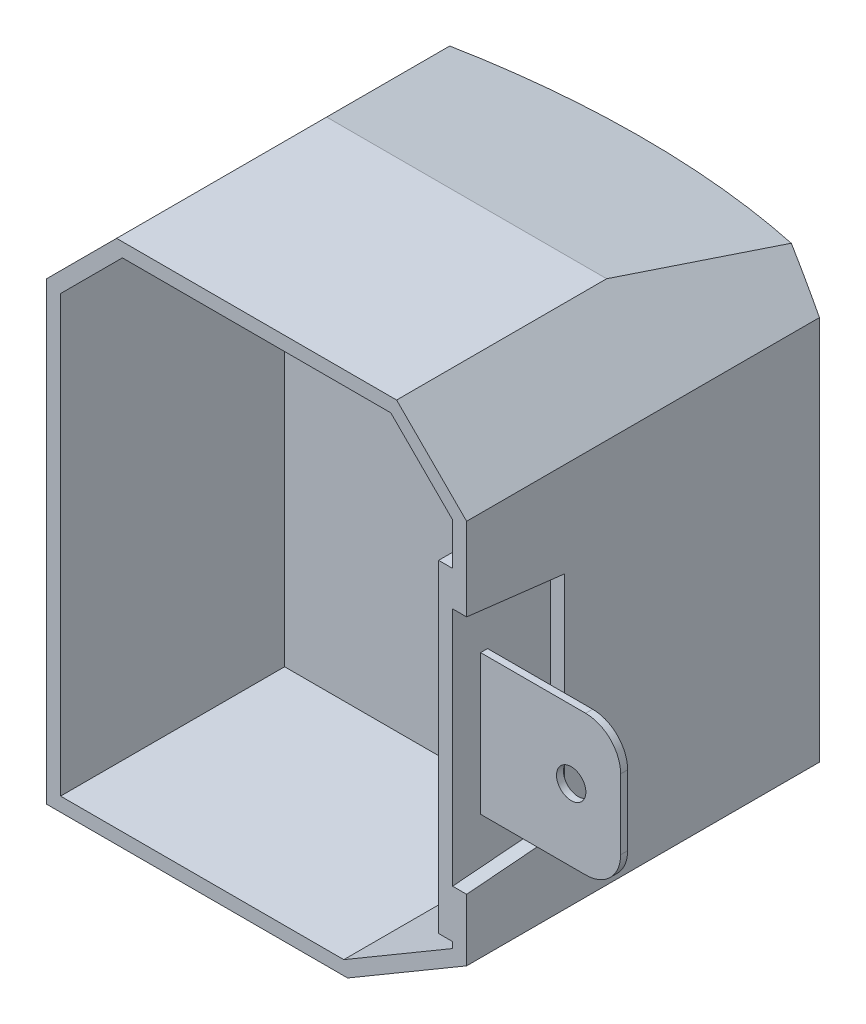
ISO-10303-21;
HEADER;
FILE_DESCRIPTION(('STEP AP214'),'2;1');
FILE_NAME('part.step','',(''),(''),'','','');
FILE_SCHEMA(('AUTOMOTIVE_DESIGN { 1 0 10303 214 1 1 1 1 }'));
ENDSEC;
DATA;
#1=APPLICATION_CONTEXT('core data for automotive mechanical design processes');
#2=APPLICATION_PROTOCOL_DEFINITION('international standard','automotive_design',2000,#1);
#3=PRODUCT_CONTEXT('',#1,'mechanical');
#4=PRODUCT('Part','Part','',(#3));
#5=PRODUCT_RELATED_PRODUCT_CATEGORY('part','',(#4));
#6=PRODUCT_DEFINITION_FORMATION('','',#4);
#7=PRODUCT_DEFINITION_CONTEXT('part definition',#1,'design');
#8=PRODUCT_DEFINITION('design','',#6,#7);
#9=PRODUCT_DEFINITION_SHAPE('','',#8);
#10=(LENGTH_UNIT() NAMED_UNIT(*) SI_UNIT(.MILLI.,.METRE.));
#11=(NAMED_UNIT(*) PLANE_ANGLE_UNIT() SI_UNIT($,.RADIAN.));
#12=(NAMED_UNIT(*) SI_UNIT($,.STERADIAN.) SOLID_ANGLE_UNIT());
#13=UNCERTAINTY_MEASURE_WITH_UNIT(LENGTH_MEASURE(1.E-05),#10,'distance_accuracy_value','');
#14=(GEOMETRIC_REPRESENTATION_CONTEXT(3) GLOBAL_UNCERTAINTY_ASSIGNED_CONTEXT((#13)) GLOBAL_UNIT_ASSIGNED_CONTEXT((#10,
#11,#12)) REPRESENTATION_CONTEXT('',''));
#15=CARTESIAN_POINT('',(0.,0.,0.));
#16=DIRECTION('',(0.,0.,1.));
#17=DIRECTION('',(1.,0.,0.));
#18=AXIS2_PLACEMENT_3D('',#15,#16,#17);
#19=CARTESIAN_POINT('',(58.,0.,0.));
#20=DIRECTION('',(-1.,0.,0.));
#21=DIRECTION('',(0.,0.,1.));
#22=AXIS2_PLACEMENT_3D('',#19,#20,#21);
#23=PLANE('',#22);
#24=DIRECTION('',(0.,1.,0.));
#25=VECTOR('',#24,1.);
#26=CARTESIAN_POINT('',(58.,11.1438921086254,41.));
#27=LINE('',#26,#25);
#28=CARTESIAN_POINT('',(58.,20.,41.));
#29=VERTEX_POINT('',#28);
#30=CARTESIAN_POINT('',(58.,51.5,41.));
#31=VERTEX_POINT('',#30);
#32=EDGE_CURVE('E470',#29,#31,#27,.T.);
#33=ORIENTED_EDGE('',*,*,#32,.T.);
#34=DIRECTION('',(0.,0.118173158234436,0.99299300333532));
#35=VECTOR('',#34,1.);
#36=CARTESIAN_POINT('',(58.,48.8242190299288,18.5157758205343));
#37=LINE('',#36,#35);
#38=CARTESIAN_POINT('',(58.,53.1660985623515,55.));
#39=VERTEX_POINT('',#38);
#40=EDGE_CURVE('E473',#31,#39,#37,.T.);
#41=ORIENTED_EDGE('',*,*,#40,.T.);
#42=DIRECTION('',(0.,1.,0.));
#43=VECTOR('',#42,1.);
#44=CARTESIAN_POINT('',(58.,53.1660985623515,55.));
#45=LINE('',#44,#43);
#46=CARTESIAN_POINT('',(58.,18.85481044112,55.));
#47=VERTEX_POINT('',#46);
#48=EDGE_CURVE('E306',#47,#39,#45,.T.);
#49=ORIENTED_EDGE('',*,*,#48,.F.);
#50=DIRECTION('',(0.,0.0815269557017353,-0.996671137082843));
#51=VECTOR('',#50,1.);
#52=CARTESIAN_POINT('',(58.,21.403736744698,23.8392476394972));
#53=LINE('',#52,#51);
#54=EDGE_CURVE('E467',#47,#29,#53,.T.);
#55=ORIENTED_EDGE('',*,*,#54,.T.);
#56=EDGE_LOOP('',(#33,#41,#49,#55));
#57=FACE_BOUND('',#56,.T.);
#58=DIRECTION('',(0.,0.,1.));
#59=VECTOR('',#58,1.);
#60=CARTESIAN_POINT('',(58.,45.75,50.));
#61=LINE('',#60,#59);
#62=CARTESIAN_POINT('',(58.,45.75,50.));
#63=VERTEX_POINT('',#62);
#64=CARTESIAN_POINT('',(58.,45.75,51.));
#65=VERTEX_POINT('',#64);
#66=EDGE_CURVE('E256',#63,#65,#61,.T.);
#67=ORIENTED_EDGE('',*,*,#66,.F.);
#68=DIRECTION('',(0.,1.,0.));
#69=VECTOR('',#68,1.);
#70=CARTESIAN_POINT('',(58.,25.75,50.));
#71=LINE('',#70,#69);
#72=CARTESIAN_POINT('',(58.,25.75,50.));
#73=VERTEX_POINT('',#72);
#74=EDGE_CURVE('E268',#73,#63,#71,.T.);
#75=ORIENTED_EDGE('',*,*,#74,.F.);
#76=DIRECTION('',(0.,0.,-1.));
#77=VECTOR('',#76,1.);
#78=CARTESIAN_POINT('',(58.,25.75,51.));
#79=LINE('',#78,#77);
#80=CARTESIAN_POINT('',(58.,25.75,51.));
#81=VERTEX_POINT('',#80);
#82=EDGE_CURVE('E277',#81,#73,#79,.T.);
#83=ORIENTED_EDGE('',*,*,#82,.F.);
#84=DIRECTION('',(0.,-1.,0.));
#85=VECTOR('',#84,1.);
#86=CARTESIAN_POINT('',(58.,45.75,51.));
#87=LINE('',#86,#85);
#88=EDGE_CURVE('E271',#65,#81,#87,.T.);
#89=ORIENTED_EDGE('',*,*,#88,.F.);
#90=EDGE_LOOP('',(#67,#75,#83,#89));
#91=FACE_BOUND('',#90,.T.);
#92=ADVANCED_FACE('F56',(#57,#91),#23,.F.);
#93=CARTESIAN_POINT('',(58.,11.1438921086254,23.));
#94=DIRECTION('',(1.,0.,0.));
#95=DIRECTION('',(0.,0.,-1.));
#96=AXIS2_PLACEMENT_3D('',#93,#94,#95);
#97=PLANE('',#96);
#98=DIRECTION('',(0.,0.,1.));
#99=VECTOR('',#98,1.);
#100=CARTESIAN_POINT('',(58.,12.004066058032,30.));
#101=LINE('',#100,#99);
#102=CARTESIAN_POINT('',(58.,12.004066058032,30.));
#103=VERTEX_POINT('',#102);
#104=CARTESIAN_POINT('',(58.,12.004066058032,55.));
#105=VERTEX_POINT('',#104);
#106=EDGE_CURVE('E303',#103,#105,#101,.T.);
#107=ORIENTED_EDGE('',*,*,#106,.F.);
#108=DIRECTION('',(0.,-1.,0.));
#109=VECTOR('',#108,1.);
#110=CARTESIAN_POINT('',(58.,58.1660985623515,30.));
#111=LINE('',#110,#109);
#112=CARTESIAN_POINT('',(58.,58.1660985623515,30.));
#113=VERTEX_POINT('',#112);
#114=EDGE_CURVE('E289',#113,#103,#111,.T.);
#115=ORIENTED_EDGE('',*,*,#114,.F.);
#116=DIRECTION('',(0.,0.,-1.));
#117=VECTOR('',#116,1.);
#118=CARTESIAN_POINT('',(58.,58.1660985623515,55.));
#119=LINE('',#118,#117);
#120=CARTESIAN_POINT('',(58.,58.1660985623515,55.));
#121=VERTEX_POINT('',#120);
#122=EDGE_CURVE('E294',#121,#113,#119,.T.);
#123=ORIENTED_EDGE('',*,*,#122,.F.);
#124=DIRECTION('',(0.,1.,0.));
#125=VECTOR('',#124,1.);
#126=CARTESIAN_POINT('',(58.,11.1438921086254,55.));
#127=LINE('',#126,#125);
#128=CARTESIAN_POINT('',(58.,64.1715728752538,55.));
#129=VERTEX_POINT('',#128);
#130=EDGE_CURVE('E333',#121,#129,#127,.T.);
#131=ORIENTED_EDGE('',*,*,#130,.T.);
#132=DIRECTION('',(0.,0.,1.));
#133=VECTOR('',#132,1.);
#134=CARTESIAN_POINT('',(58.,64.1715728752538,23.));
#135=LINE('',#134,#133);
#136=CARTESIAN_POINT('',(58.,64.1715728752538,23.));
#137=VERTEX_POINT('',#136);
#138=EDGE_CURVE('E362',#137,#129,#135,.T.);
#139=ORIENTED_EDGE('',*,*,#138,.F.);
#140=DIRECTION('',(0.,1.,0.));
#141=VECTOR('',#140,1.);
#142=CARTESIAN_POINT('',(58.,11.1438921086254,23.));
#143=LINE('',#142,#141);
#144=CARTESIAN_POINT('',(58.,11.1438921086254,23.));
#145=VERTEX_POINT('',#144);
#146=EDGE_CURVE('E340',#145,#137,#143,.T.);
#147=ORIENTED_EDGE('',*,*,#146,.F.);
#148=DIRECTION('',(0.,0.,1.));
#149=VECTOR('',#148,1.);
#150=CARTESIAN_POINT('',(58.,11.1438921086254,23.));
#151=LINE('',#150,#149);
#152=CARTESIAN_POINT('',(58.,11.1438921086254,55.));
#153=VERTEX_POINT('',#152);
#154=EDGE_CURVE('E382',#145,#153,#151,.T.);
#155=ORIENTED_EDGE('',*,*,#154,.T.);
#156=EDGE_CURVE('E363',#153,#105,#127,.T.);
#157=ORIENTED_EDGE('',*,*,#156,.T.);
#158=EDGE_LOOP('',(#107,#115,#123,#131,#139,#147,#155,#157));
#159=FACE_BOUND('',#158,.T.);
#160=ADVANCED_FACE('F517',(#159),#97,.F.);
#161=CARTESIAN_POINT('',(-3.,75.,25.));
#162=DIRECTION('',(0.,-0.98058067569092,0.196116135138184));
#163=DIRECTION('',(0.,-0.196116135138184,-0.98058067569092));
#164=AXIS2_PLACEMENT_3D('',#161,#162,#163);
#165=PLANE('',#164);
#166=DIRECTION('',(0.192450089729876,-0.192450089729875,-0.962250448649376));
#167=VECTOR('',#166,1.);
#168=CARTESIAN_POINT('',(48.037037037037,76.962962962963,34.8148148148148));
#169=LINE('',#168,#167);
#170=CARTESIAN_POINT('',(50.,75.,25.));
#171=VERTEX_POINT('',#170);
#172=CARTESIAN_POINT('',(54.3957199879455,70.6042800120545,3.0214000602723));
#173=VERTEX_POINT('',#172);
#174=EDGE_CURVE('E460',#171,#173,#169,.T.);
#175=ORIENTED_EDGE('',*,*,#174,.T.);
#176=CARTESIAN_POINT('',(30.,90.,100.));
#177=DIRECTION('',(0.,-0.98058067569092,0.196116135138184));
#178=DIRECTION('',(0.,0.196116135138184,0.98058067569092));
#179=AXIS2_PLACEMENT_3D('',#176,#177,#178);
#180=ELLIPSE('',#179,101.980390271856,100.);
#181=CARTESIAN_POINT('',(5.60428001205445,70.6042800120544,3.02140006027228));
#182=VERTEX_POINT('',#181);
#183=EDGE_CURVE('E404',#182,#173,#180,.T.);
#184=ORIENTED_EDGE('',*,*,#183,.F.);
#185=DIRECTION('',(0.192450089729876,0.192450089729875,0.962250448649376));
#186=VECTOR('',#185,1.);
#187=CARTESIAN_POINT('',(9.51851851851852,74.5185185185185,22.5925925925926));
#188=LINE('',#187,#186);
#189=CARTESIAN_POINT('',(10.,75.,25.));
#190=VERTEX_POINT('',#189);
#191=EDGE_CURVE('E458',#182,#190,#188,.T.);
#192=ORIENTED_EDGE('',*,*,#191,.T.);
#193=DIRECTION('',(1.,0.,0.));
#194=VECTOR('',#193,1.);
#195=CARTESIAN_POINT('',(-3.,75.,25.));
#196=LINE('',#195,#194);
#197=EDGE_CURVE('E433',#190,#171,#196,.T.);
#198=ORIENTED_EDGE('',*,*,#197,.T.);
#199=EDGE_LOOP('',(#175,#184,#192,#198));
#200=FACE_BOUND('',#199,.T.);
#201=ADVANCED_FACE('F523',(#200),#165,.F.);
#202=CARTESIAN_POINT('',(-3.,0.,20.));
#203=DIRECTION('',(0.,0.894427190999916,0.447213595499958));
#204=DIRECTION('',(0.,-0.447213595499958,0.894427190999916));
#205=AXIS2_PLACEMENT_3D('',#202,#203,#204);
#206=PLANE('',#205);
#207=CARTESIAN_POINT('',(30.,-40.,100.));
#208=DIRECTION('',(0.,0.894427190999916,0.447213595499958));
#209=DIRECTION('',(0.,0.447213595499958,-0.894427190999916));
#210=AXIS2_PLACEMENT_3D('',#207,#208,#209);
#211=ELLIPSE('',#210,111.803398874989,100.);
#212=CARTESIAN_POINT('',(56.8732597656954,8.16074103864437,3.67851792271126));
#213=VERTEX_POINT('',#212);
#214=CARTESIAN_POINT('',(0.,7.69696007084729,4.60607985830543));
#215=VERTEX_POINT('',#214);
#216=EDGE_CURVE('E406',#213,#215,#211,.T.);
#217=ORIENTED_EDGE('',*,*,#216,.F.);
#218=DIRECTION('',(-0.605216026332569,-0.356009427254452,0.712018854508904));
#219=VECTOR('',#218,1.);
#220=CARTESIAN_POINT('',(26.1508238276299,-9.91128010139417,39.8225602027883));
#221=LINE('',#220,#219);
#222=CARTESIAN_POINT('',(43.,0.,20.));
#223=VERTEX_POINT('',#222);
#224=EDGE_CURVE('E456',#213,#223,#221,.T.);
#225=ORIENTED_EDGE('',*,*,#224,.T.);
#226=DIRECTION('',(1.,0.,0.));
#227=VECTOR('',#226,1.);
#228=CARTESIAN_POINT('',(-3.,0.,20.));
#229=LINE('',#228,#227);
#230=CARTESIAN_POINT('',(0.,0.,20.));
#231=VERTEX_POINT('',#230);
#232=EDGE_CURVE('E434',#231,#223,#229,.T.);
#233=ORIENTED_EDGE('',*,*,#232,.F.);
#234=DIRECTION('',(0.,-0.447213595499958,0.894427190999916));
#235=VECTOR('',#234,1.);
#236=CARTESIAN_POINT('',(0.,1.,18.));
#237=LINE('',#236,#235);
#238=EDGE_CURVE('E437',#215,#231,#237,.T.);
#239=ORIENTED_EDGE('',*,*,#238,.F.);
#240=EDGE_LOOP('',(#217,#225,#233,#239));
#241=FACE_BOUND('',#240,.T.);
#242=ADVANCED_FACE('F602',(#241),#206,.F.);
#243=CARTESIAN_POINT('',(60.,0.,55.));
#244=DIRECTION('',(-1.,0.,0.));
#245=DIRECTION('',(0.,0.,1.));
#246=AXIS2_PLACEMENT_3D('',#243,#244,#245);
#247=PLANE('',#246);
#248=DIRECTION('',(0.,1.,0.));
#249=VECTOR('',#248,1.);
#250=CARTESIAN_POINT('',(60.,0.,55.));
#251=LINE('',#250,#249);
#252=CARTESIAN_POINT('',(60.,53.1660985623515,55.));
#253=VERTEX_POINT('',#252);
#254=CARTESIAN_POINT('',(60.,65.,55.));
#255=VERTEX_POINT('',#254);
#256=EDGE_CURVE('E446',#253,#255,#251,.T.);
#257=ORIENTED_EDGE('',*,*,#256,.F.);
#258=DIRECTION('',(0.,0.118173158234436,0.99299300333532));
#259=VECTOR('',#258,1.);
#260=CARTESIAN_POINT('',(60.,51.5,41.));
#261=LINE('',#260,#259);
#262=CARTESIAN_POINT('',(60.,51.5,41.));
#263=VERTEX_POINT('',#262);
#264=EDGE_CURVE('E322',#263,#253,#261,.T.);
#265=ORIENTED_EDGE('',*,*,#264,.F.);
#266=DIRECTION('',(0.,1.,0.));
#267=VECTOR('',#266,1.);
#268=CARTESIAN_POINT('',(60.,51.5,41.));
#269=LINE('',#268,#267);
#270=CARTESIAN_POINT('',(60.,20.,41.));
#271=VERTEX_POINT('',#270);
#272=EDGE_CURVE('E327',#271,#263,#269,.T.);
#273=ORIENTED_EDGE('',*,*,#272,.F.);
#274=DIRECTION('',(0.,0.0815269557017353,-0.996671137082843));
#275=VECTOR('',#274,1.);
#276=CARTESIAN_POINT('',(60.,20.,41.));
#277=LINE('',#276,#275);
#278=CARTESIAN_POINT('',(60.,18.85481044112,55.));
#279=VERTEX_POINT('',#278);
#280=EDGE_CURVE('E324',#279,#271,#277,.T.);
#281=ORIENTED_EDGE('',*,*,#280,.F.);
#282=CARTESIAN_POINT('',(60.,10.,55.));
#283=VERTEX_POINT('',#282);
#284=EDGE_CURVE('E447',#283,#279,#251,.T.);
#285=ORIENTED_EDGE('',*,*,#284,.F.);
#286=DIRECTION('',(0.,0.,-1.));
#287=VECTOR('',#286,1.);
#288=CARTESIAN_POINT('',(60.,10.,63.));
#289=LINE('',#288,#287);
#290=CARTESIAN_POINT('',(60.,10.,4.60607985830543));
#291=VERTEX_POINT('',#290);
#292=EDGE_CURVE('E426',#283,#291,#289,.T.);
#293=ORIENTED_EDGE('',*,*,#292,.T.);
#294=DIRECTION('',(0.,1.,0.));
#295=VECTOR('',#294,1.);
#296=CARTESIAN_POINT('',(60.,2.,4.60607985830543));
#297=LINE('',#296,#295);
#298=CARTESIAN_POINT('',(60.,65.,4.60607985830543));
#299=VERTEX_POINT('',#298);
#300=EDGE_CURVE('E384',#291,#299,#297,.T.);
#301=ORIENTED_EDGE('',*,*,#300,.T.);
#302=DIRECTION('',(0.,0.,-1.));
#303=VECTOR('',#302,1.);
#304=CARTESIAN_POINT('',(60.,65.,63.));
#305=LINE('',#304,#303);
#306=EDGE_CURVE('E409',#255,#299,#305,.T.);
#307=ORIENTED_EDGE('',*,*,#306,.F.);
#308=EDGE_LOOP('',(#257,#265,#273,#281,#285,#293,#301,#307));
#309=FACE_BOUND('',#308,.T.);
#310=ADVANCED_FACE('F600',(#309),#247,.F.);
#311=CARTESIAN_POINT('',(43.,0.,63.));
#312=DIRECTION('',(-0.507020126563394,0.86193421515777,0.));
#313=DIRECTION('',(-0.861934215157769,-0.507020126563394,0.));
#314=AXIS2_PLACEMENT_3D('',#311,#312,#313);
#315=PLANE('',#314);
#316=CARTESIAN_POINT('',(30.,-7.6470588235294,100.));
#317=DIRECTION('',(-0.507020126563394,0.86193421515777,0.));
#318=DIRECTION('',(0.861934215157769,0.507020126563394,0.));
#319=AXIS2_PLACEMENT_3D('',#316,#317,#318);
#320=ELLIPSE('',#319,116.018134843035,100.);
#321=EDGE_CURVE('E399',#291,#213,#320,.T.);
#322=ORIENTED_EDGE('',*,*,#321,.F.);
#323=ORIENTED_EDGE('',*,*,#292,.F.);
#324=DIRECTION('',(-0.861934215157769,-0.507020126563394,0.));
#325=VECTOR('',#324,1.);
#326=CARTESIAN_POINT('',(11.0539845758355,-18.7917737789203,55.));
#327=LINE('',#326,#325);
#328=CARTESIAN_POINT('',(43.,0.,55.));
#329=VERTEX_POINT('',#328);
#330=EDGE_CURVE('E429',#283,#329,#327,.T.);
#331=ORIENTED_EDGE('',*,*,#330,.T.);
#332=DIRECTION('',(0.,0.,-1.));
#333=VECTOR('',#332,1.);
#334=CARTESIAN_POINT('',(43.,0.,63.));
#335=LINE('',#334,#333);
#336=EDGE_CURVE('E425',#329,#223,#335,.T.);
#337=ORIENTED_EDGE('',*,*,#336,.T.);
#338=ORIENTED_EDGE('',*,*,#224,.F.);
#339=EDGE_LOOP('',(#322,#323,#331,#337,#338));
#340=FACE_BOUND('',#339,.T.);
#341=ADVANCED_FACE('F591',(#340),#315,.F.);
#342=CARTESIAN_POINT('',(50.,75.,63.));
#343=DIRECTION('',(-0.707106781186547,-0.707106781186548,0.));
#344=DIRECTION('',(0.707106781186548,-0.707106781186547,0.));
#345=AXIS2_PLACEMENT_3D('',#342,#343,#344);
#346=PLANE('',#345);
#347=CARTESIAN_POINT('',(30.,95.,100.));
#348=DIRECTION('',(-0.707106781186547,-0.707106781186548,0.));
#349=DIRECTION('',(-0.707106781186548,0.707106781186547,0.));
#350=AXIS2_PLACEMENT_3D('',#347,#348,#349);
#351=ELLIPSE('',#350,141.421356237309,100.);
#352=EDGE_CURVE('E465',#173,#299,#351,.T.);
#353=ORIENTED_EDGE('',*,*,#352,.F.);
#354=ORIENTED_EDGE('',*,*,#174,.F.);
#355=DIRECTION('',(0.,0.,-1.));
#356=VECTOR('',#355,1.);
#357=CARTESIAN_POINT('',(50.,75.,63.));
#358=LINE('',#357,#356);
#359=CARTESIAN_POINT('',(50.,75.,55.));
#360=VERTEX_POINT('',#359);
#361=EDGE_CURVE('E413',#360,#171,#358,.T.);
#362=ORIENTED_EDGE('',*,*,#361,.F.);
#363=DIRECTION('',(0.707106781186548,-0.707106781186547,0.));
#364=VECTOR('',#363,1.);
#365=CARTESIAN_POINT('',(62.5,62.5,55.));
#366=LINE('',#365,#364);
#367=EDGE_CURVE('E422',#360,#255,#366,.T.);
#368=ORIENTED_EDGE('',*,*,#367,.T.);
#369=ORIENTED_EDGE('',*,*,#306,.T.);
#370=EDGE_LOOP('',(#353,#354,#362,#368,#369));
#371=FACE_BOUND('',#370,.T.);
#372=ADVANCED_FACE('F587',(#371),#346,.F.);
#373=CARTESIAN_POINT('',(0.,75.,55.));
#374=DIRECTION('',(1.,0.,0.));
#375=DIRECTION('',(0.,0.,-1.));
#376=AXIS2_PLACEMENT_3D('',#373,#374,#375);
#377=PLANE('',#376);
#378=DIRECTION('',(0.,1.,0.));
#379=VECTOR('',#378,1.);
#380=CARTESIAN_POINT('',(0.,2.,4.60607985830543));
#381=LINE('',#380,#379);
#382=CARTESIAN_POINT('',(0.,65.,4.60607985830543));
#383=VERTEX_POINT('',#382);
#384=EDGE_CURVE('E402',#215,#383,#381,.T.);
#385=ORIENTED_EDGE('',*,*,#384,.F.);
#386=ORIENTED_EDGE('',*,*,#238,.T.);
#387=DIRECTION('',(0.,0.,-1.));
#388=VECTOR('',#387,1.);
#389=CARTESIAN_POINT('',(0.,0.,55.));
#390=LINE('',#389,#388);
#391=CARTESIAN_POINT('',(0.,0.,55.));
#392=VERTEX_POINT('',#391);
#393=EDGE_CURVE('E453',#392,#231,#390,.T.);
#394=ORIENTED_EDGE('',*,*,#393,.F.);
#395=DIRECTION('',(0.,-1.,0.));
#396=VECTOR('',#395,1.);
#397=CARTESIAN_POINT('',(0.,75.,55.));
#398=LINE('',#397,#396);
#399=CARTESIAN_POINT('',(0.,65.,55.));
#400=VERTEX_POINT('',#399);
#401=EDGE_CURVE('E441',#400,#392,#398,.T.);
#402=ORIENTED_EDGE('',*,*,#401,.F.);
#403=DIRECTION('',(0.,0.,-1.));
#404=VECTOR('',#403,1.);
#405=CARTESIAN_POINT('',(0.,65.,63.));
#406=LINE('',#405,#404);
#407=EDGE_CURVE('E416',#400,#383,#406,.T.);
#408=ORIENTED_EDGE('',*,*,#407,.T.);
#409=EDGE_LOOP('',(#385,#386,#394,#402,#408));
#410=FACE_BOUND('',#409,.T.);
#411=ADVANCED_FACE('F590',(#410),#377,.F.);
#412=CARTESIAN_POINT('',(10.,75.,63.));
#413=DIRECTION('',(0.707106781186547,-0.707106781186548,0.));
#414=DIRECTION('',(0.707106781186548,0.707106781186547,0.));
#415=AXIS2_PLACEMENT_3D('',#412,#413,#414);
#416=PLANE('',#415);
#417=CARTESIAN_POINT('',(30.,95.,100.));
#418=DIRECTION('',(0.707106781186547,-0.707106781186548,0.));
#419=DIRECTION('',(0.707106781186548,0.707106781186547,0.));
#420=AXIS2_PLACEMENT_3D('',#417,#418,#419);
#421=ELLIPSE('',#420,141.421356237309,100.);
#422=EDGE_CURVE('E463',#383,#182,#421,.T.);
#423=ORIENTED_EDGE('',*,*,#422,.F.);
#424=ORIENTED_EDGE('',*,*,#407,.F.);
#425=DIRECTION('',(0.707106781186548,0.707106781186547,0.));
#426=VECTOR('',#425,1.);
#427=CARTESIAN_POINT('',(-32.5,32.5,55.));
#428=LINE('',#427,#426);
#429=CARTESIAN_POINT('',(10.,75.,55.));
#430=VERTEX_POINT('',#429);
#431=EDGE_CURVE('E412',#400,#430,#428,.T.);
#432=ORIENTED_EDGE('',*,*,#431,.T.);
#433=DIRECTION('',(0.,0.,-1.));
#434=VECTOR('',#433,1.);
#435=CARTESIAN_POINT('',(10.,75.,63.));
#436=LINE('',#435,#434);
#437=EDGE_CURVE('E408',#430,#190,#436,.T.);
#438=ORIENTED_EDGE('',*,*,#437,.T.);
#439=ORIENTED_EDGE('',*,*,#191,.F.);
#440=EDGE_LOOP('',(#423,#424,#432,#438,#439));
#441=FACE_BOUND('',#440,.T.);
#442=ADVANCED_FACE('F593',(#441),#416,.F.);
#443=CARTESIAN_POINT('',(0.,0.,55.));
#444=DIRECTION('',(0.,1.,0.));
#445=DIRECTION('',(0.,0.,1.));
#446=AXIS2_PLACEMENT_3D('',#443,#444,#445);
#447=PLANE('',#446);
#448=ORIENTED_EDGE('',*,*,#232,.T.);
#449=ORIENTED_EDGE('',*,*,#336,.F.);
#450=DIRECTION('',(1.,0.,0.));
#451=VECTOR('',#450,1.);
#452=CARTESIAN_POINT('',(0.,0.,55.));
#453=LINE('',#452,#451);
#454=EDGE_CURVE('E443',#392,#329,#453,.T.);
#455=ORIENTED_EDGE('',*,*,#454,.F.);
#456=ORIENTED_EDGE('',*,*,#393,.T.);
#457=EDGE_LOOP('',(#448,#449,#455,#456));
#458=FACE_BOUND('',#457,.T.);
#459=ADVANCED_FACE('F596',(#458),#447,.F.);
#460=CARTESIAN_POINT('',(60.,75.,55.));
#461=DIRECTION('',(0.,-1.,0.));
#462=DIRECTION('',(0.,0.,-1.));
#463=AXIS2_PLACEMENT_3D('',#460,#461,#462);
#464=PLANE('',#463);
#465=DIRECTION('',(-1.,0.,0.));
#466=VECTOR('',#465,1.);
#467=CARTESIAN_POINT('',(60.,75.,55.));
#468=LINE('',#467,#466);
#469=EDGE_CURVE('E450',#360,#430,#468,.T.);
#470=ORIENTED_EDGE('',*,*,#469,.F.);
#471=ORIENTED_EDGE('',*,*,#361,.T.);
#472=ORIENTED_EDGE('',*,*,#197,.F.);
#473=ORIENTED_EDGE('',*,*,#437,.F.);
#474=EDGE_LOOP('',(#470,#471,#472,#473));
#475=FACE_BOUND('',#474,.T.);
#476=ADVANCED_FACE('F611',(#475),#464,.F.);
#477=CARTESIAN_POINT('',(0.,0.,55.));
#478=DIRECTION('',(0.,0.,1.));
#479=DIRECTION('',(1.,0.,0.));
#480=AXIS2_PLACEMENT_3D('',#477,#478,#479);
#481=PLANE('',#480);
#482=DIRECTION('',(1.,0.,0.));
#483=VECTOR('',#482,1.);
#484=CARTESIAN_POINT('',(28.,18.85481044112,55.));
#485=LINE('',#484,#483);
#486=EDGE_CURVE('E336',#47,#279,#485,.T.);
#487=ORIENTED_EDGE('',*,*,#486,.F.);
#488=ORIENTED_EDGE('',*,*,#48,.T.);
#489=DIRECTION('',(1.,0.,0.));
#490=VECTOR('',#489,1.);
#491=CARTESIAN_POINT('',(28.,53.1660985623515,55.));
#492=LINE('',#491,#490);
#493=EDGE_CURVE('E330',#39,#253,#492,.T.);
#494=ORIENTED_EDGE('',*,*,#493,.T.);
#495=ORIENTED_EDGE('',*,*,#256,.T.);
#496=ORIENTED_EDGE('',*,*,#367,.F.);
#497=ORIENTED_EDGE('',*,*,#469,.T.);
#498=ORIENTED_EDGE('',*,*,#431,.F.);
#499=ORIENTED_EDGE('',*,*,#401,.T.);
#500=ORIENTED_EDGE('',*,*,#454,.T.);
#501=ORIENTED_EDGE('',*,*,#330,.F.);
#502=ORIENTED_EDGE('',*,*,#284,.T.);
#503=EDGE_LOOP('',(#487,#488,#494,#495,#496,#497,#498,#499,#500,#501,#502));
#504=FACE_BOUND('',#503,.T.);
#505=DIRECTION('',(1.,0.,0.));
#506=VECTOR('',#505,1.);
#507=CARTESIAN_POINT('',(56.,12.004066058032,55.));
#508=LINE('',#507,#506);
#509=CARTESIAN_POINT('',(56.,12.004066058032,55.));
#510=VERTEX_POINT('',#509);
#511=EDGE_CURVE('E316',#510,#105,#508,.T.);
#512=ORIENTED_EDGE('',*,*,#511,.T.);
#513=ORIENTED_EDGE('',*,*,#156,.F.);
#514=DIRECTION('',(0.86193421515777,0.507020126563394,0.));
#515=VECTOR('',#514,1.);
#516=CARTESIAN_POINT('',(42.4553834153368,2.,55.));
#517=LINE('',#516,#515);
#518=CARTESIAN_POINT('',(42.4553834153368,2.,55.));
#519=VERTEX_POINT('',#518);
#520=EDGE_CURVE('E344',#519,#153,#517,.T.);
#521=ORIENTED_EDGE('',*,*,#520,.F.);
#522=DIRECTION('',(1.,0.,0.));
#523=VECTOR('',#522,1.);
#524=CARTESIAN_POINT('',(2.,2.,55.));
#525=LINE('',#524,#523);
#526=CARTESIAN_POINT('',(2.,2.,55.));
#527=VERTEX_POINT('',#526);
#528=EDGE_CURVE('E377',#527,#519,#525,.T.);
#529=ORIENTED_EDGE('',*,*,#528,.F.);
#530=DIRECTION('',(0.,-1.,0.));
#531=VECTOR('',#530,1.);
#532=CARTESIAN_POINT('',(2.,64.1715728752538,55.));
#533=LINE('',#532,#531);
#534=CARTESIAN_POINT('',(2.,64.1715728752538,55.));
#535=VERTEX_POINT('',#534);
#536=EDGE_CURVE('E374',#535,#527,#533,.T.);
#537=ORIENTED_EDGE('',*,*,#536,.F.);
#538=DIRECTION('',(-0.707106781186548,-0.707106781186548,0.));
#539=VECTOR('',#538,1.);
#540=CARTESIAN_POINT('',(10.8284271247462,73.,55.));
#541=LINE('',#540,#539);
#542=CARTESIAN_POINT('',(10.8284271247462,73.,55.));
#543=VERTEX_POINT('',#542);
#544=EDGE_CURVE('E371',#543,#535,#541,.T.);
#545=ORIENTED_EDGE('',*,*,#544,.F.);
#546=DIRECTION('',(-1.,0.,0.));
#547=VECTOR('',#546,1.);
#548=CARTESIAN_POINT('',(49.1715728752538,73.,55.));
#549=LINE('',#548,#547);
#550=CARTESIAN_POINT('',(49.1715728752538,73.,55.));
#551=VERTEX_POINT('',#550);
#552=EDGE_CURVE('E368',#551,#543,#549,.T.);
#553=ORIENTED_EDGE('',*,*,#552,.F.);
#554=DIRECTION('',(-0.707106781186548,0.707106781186548,0.));
#555=VECTOR('',#554,1.);
#556=CARTESIAN_POINT('',(58.,64.1715728752538,55.));
#557=LINE('',#556,#555);
#558=EDGE_CURVE('E365',#129,#551,#557,.T.);
#559=ORIENTED_EDGE('',*,*,#558,.F.);
#560=ORIENTED_EDGE('',*,*,#130,.F.);
#561=DIRECTION('',(1.,0.,0.));
#562=VECTOR('',#561,1.);
#563=CARTESIAN_POINT('',(56.,58.1660985623515,55.));
#564=LINE('',#563,#562);
#565=CARTESIAN_POINT('',(56.,58.1660985623515,55.));
#566=VERTEX_POINT('',#565);
#567=EDGE_CURVE('E313',#566,#121,#564,.T.);
#568=ORIENTED_EDGE('',*,*,#567,.F.);
#569=DIRECTION('',(0.,1.,0.));
#570=VECTOR('',#569,1.);
#571=CARTESIAN_POINT('',(56.,12.004066058032,55.));
#572=LINE('',#571,#570);
#573=EDGE_CURVE('E296',#510,#566,#572,.T.);
#574=ORIENTED_EDGE('',*,*,#573,.F.);
#575=EDGE_LOOP('',(#512,#513,#521,#529,#537,#545,#553,#559,#560,#568,#574));
#576=FACE_BOUND('',#575,.T.);
#577=ADVANCED_FACE('F585',(#504,#576),#481,.T.);
#578=CARTESIAN_POINT('',(30.,2.,100.));
#579=DIRECTION('',(0.,1.,0.));
#580=DIRECTION('',(0.,0.,1.));
#581=AXIS2_PLACEMENT_3D('',#578,#579,#580);
#582=CYLINDRICAL_SURFACE('',#581,100.);
#583=ORIENTED_EDGE('',*,*,#216,.T.);
#584=ORIENTED_EDGE('',*,*,#384,.T.);
#585=ORIENTED_EDGE('',*,*,#422,.T.);
#586=ORIENTED_EDGE('',*,*,#183,.T.);
#587=ORIENTED_EDGE('',*,*,#352,.T.);
#588=ORIENTED_EDGE('',*,*,#300,.F.);
#589=ORIENTED_EDGE('',*,*,#321,.T.);
#590=EDGE_LOOP('',(#583,#584,#585,#586,#587,#588,#589));
#591=FACE_BOUND('',#590,.T.);
#592=ADVANCED_FACE('F563',(#591),#582,.T.);
#593=CARTESIAN_POINT('',(42.4553834153368,2.,23.));
#594=DIRECTION('',(0.507020126563394,-0.861934215157769,0.));
#595=DIRECTION('',(0.86193421515777,0.507020126563394,0.));
#596=AXIS2_PLACEMENT_3D('',#593,#594,#595);
#597=PLANE('',#596);
#598=ORIENTED_EDGE('',*,*,#520,.T.);
#599=ORIENTED_EDGE('',*,*,#154,.F.);
#600=DIRECTION('',(0.86193421515777,0.507020126563394,0.));
#601=VECTOR('',#600,1.);
#602=CARTESIAN_POINT('',(42.4553834153368,2.,23.));
#603=LINE('',#602,#601);
#604=CARTESIAN_POINT('',(42.4553834153368,2.,23.));
#605=VERTEX_POINT('',#604);
#606=EDGE_CURVE('E359',#605,#145,#603,.T.);
#607=ORIENTED_EDGE('',*,*,#606,.F.);
#608=DIRECTION('',(0.,0.,1.));
#609=VECTOR('',#608,1.);
#610=CARTESIAN_POINT('',(42.4553834153368,2.,23.));
#611=LINE('',#610,#609);
#612=EDGE_CURVE('E385',#605,#519,#611,.T.);
#613=ORIENTED_EDGE('',*,*,#612,.T.);
#614=EDGE_LOOP('',(#598,#599,#607,#613));
#615=FACE_BOUND('',#614,.T.);
#616=ADVANCED_FACE('F559',(#615),#597,.F.);
#617=CARTESIAN_POINT('',(2.,2.,23.));
#618=DIRECTION('',(0.,-1.,0.));
#619=DIRECTION('',(1.,0.,0.));
#620=AXIS2_PLACEMENT_3D('',#617,#618,#619);
#621=PLANE('',#620);
#622=ORIENTED_EDGE('',*,*,#528,.T.);
#623=ORIENTED_EDGE('',*,*,#612,.F.);
#624=DIRECTION('',(1.,0.,0.));
#625=VECTOR('',#624,1.);
#626=CARTESIAN_POINT('',(2.,2.,23.));
#627=LINE('',#626,#625);
#628=CARTESIAN_POINT('',(2.,2.,23.));
#629=VERTEX_POINT('',#628);
#630=EDGE_CURVE('E356',#629,#605,#627,.T.);
#631=ORIENTED_EDGE('',*,*,#630,.F.);
#632=DIRECTION('',(0.,0.,1.));
#633=VECTOR('',#632,1.);
#634=CARTESIAN_POINT('',(2.,2.,23.));
#635=LINE('',#634,#633);
#636=EDGE_CURVE('E387',#629,#527,#635,.T.);
#637=ORIENTED_EDGE('',*,*,#636,.T.);
#638=EDGE_LOOP('',(#622,#623,#631,#637));
#639=FACE_BOUND('',#638,.T.);
#640=ADVANCED_FACE('F562',(#639),#621,.F.);
#641=CARTESIAN_POINT('',(2.,64.1715728752538,23.));
#642=DIRECTION('',(-1.,0.,0.));
#643=DIRECTION('',(0.,0.,1.));
#644=AXIS2_PLACEMENT_3D('',#641,#642,#643);
#645=PLANE('',#644);
#646=ORIENTED_EDGE('',*,*,#536,.T.);
#647=ORIENTED_EDGE('',*,*,#636,.F.);
#648=DIRECTION('',(0.,-1.,0.));
#649=VECTOR('',#648,1.);
#650=CARTESIAN_POINT('',(2.,64.1715728752538,23.));
#651=LINE('',#650,#649);
#652=CARTESIAN_POINT('',(2.,64.1715728752538,23.));
#653=VERTEX_POINT('',#652);
#654=EDGE_CURVE('E353',#653,#629,#651,.T.);
#655=ORIENTED_EDGE('',*,*,#654,.F.);
#656=DIRECTION('',(0.,0.,1.));
#657=VECTOR('',#656,1.);
#658=CARTESIAN_POINT('',(2.,64.1715728752538,23.));
#659=LINE('',#658,#657);
#660=EDGE_CURVE('E389',#653,#535,#659,.T.);
#661=ORIENTED_EDGE('',*,*,#660,.T.);
#662=EDGE_LOOP('',(#646,#647,#655,#661));
#663=FACE_BOUND('',#662,.T.);
#664=ADVANCED_FACE('F567',(#663),#645,.F.);
#665=CARTESIAN_POINT('',(10.8284271247462,73.,23.));
#666=DIRECTION('',(-0.707106781186547,0.707106781186547,0.));
#667=DIRECTION('',(-0.707106781186548,-0.707106781186548,0.));
#668=AXIS2_PLACEMENT_3D('',#665,#666,#667);
#669=PLANE('',#668);
#670=ORIENTED_EDGE('',*,*,#544,.T.);
#671=ORIENTED_EDGE('',*,*,#660,.F.);
#672=DIRECTION('',(-0.707106781186548,-0.707106781186548,0.));
#673=VECTOR('',#672,1.);
#674=CARTESIAN_POINT('',(10.8284271247462,73.,23.));
#675=LINE('',#674,#673);
#676=CARTESIAN_POINT('',(10.8284271247462,73.,23.));
#677=VERTEX_POINT('',#676);
#678=EDGE_CURVE('E350',#677,#653,#675,.T.);
#679=ORIENTED_EDGE('',*,*,#678,.F.);
#680=DIRECTION('',(0.,0.,1.));
#681=VECTOR('',#680,1.);
#682=CARTESIAN_POINT('',(10.8284271247462,73.,23.));
#683=LINE('',#682,#681);
#684=EDGE_CURVE('E391',#677,#543,#683,.T.);
#685=ORIENTED_EDGE('',*,*,#684,.T.);
#686=EDGE_LOOP('',(#670,#671,#679,#685));
#687=FACE_BOUND('',#686,.T.);
#688=ADVANCED_FACE('F571',(#687),#669,.F.);
#689=CARTESIAN_POINT('',(49.1715728752538,73.,23.));
#690=DIRECTION('',(0.,1.,0.));
#691=DIRECTION('',(0.,0.,1.));
#692=AXIS2_PLACEMENT_3D('',#689,#690,#691);
#693=PLANE('',#692);
#694=ORIENTED_EDGE('',*,*,#552,.T.);
#695=ORIENTED_EDGE('',*,*,#684,.F.);
#696=DIRECTION('',(-1.,0.,0.));
#697=VECTOR('',#696,1.);
#698=CARTESIAN_POINT('',(49.1715728752538,73.,23.));
#699=LINE('',#698,#697);
#700=CARTESIAN_POINT('',(49.1715728752538,73.,23.));
#701=VERTEX_POINT('',#700);
#702=EDGE_CURVE('E347',#701,#677,#699,.T.);
#703=ORIENTED_EDGE('',*,*,#702,.F.);
#704=DIRECTION('',(0.,0.,1.));
#705=VECTOR('',#704,1.);
#706=CARTESIAN_POINT('',(49.1715728752538,73.,23.));
#707=LINE('',#706,#705);
#708=EDGE_CURVE('E393',#701,#551,#707,.T.);
#709=ORIENTED_EDGE('',*,*,#708,.T.);
#710=EDGE_LOOP('',(#694,#695,#703,#709));
#711=FACE_BOUND('',#710,.T.);
#712=ADVANCED_FACE('F575',(#711),#693,.F.);
#713=CARTESIAN_POINT('',(58.,64.1715728752538,23.));
#714=DIRECTION('',(0.707106781186547,0.707106781186547,0.));
#715=DIRECTION('',(-0.707106781186548,0.707106781186548,0.));
#716=AXIS2_PLACEMENT_3D('',#713,#714,#715);
#717=PLANE('',#716);
#718=ORIENTED_EDGE('',*,*,#558,.T.);
#719=ORIENTED_EDGE('',*,*,#708,.F.);
#720=DIRECTION('',(-0.707106781186548,0.707106781186548,0.));
#721=VECTOR('',#720,1.);
#722=CARTESIAN_POINT('',(58.,64.1715728752538,23.));
#723=LINE('',#722,#721);
#724=EDGE_CURVE('E343',#137,#701,#723,.T.);
#725=ORIENTED_EDGE('',*,*,#724,.F.);
#726=ORIENTED_EDGE('',*,*,#138,.T.);
#727=EDGE_LOOP('',(#718,#719,#725,#726));
#728=FACE_BOUND('',#727,.T.);
#729=ADVANCED_FACE('F557',(#728),#717,.F.);
#730=CARTESIAN_POINT('',(0.,0.,23.));
#731=DIRECTION('',(0.,0.,1.));
#732=DIRECTION('',(1.,0.,0.));
#733=AXIS2_PLACEMENT_3D('',#730,#731,#732);
#734=PLANE('',#733);
#735=ORIENTED_EDGE('',*,*,#146,.T.);
#736=ORIENTED_EDGE('',*,*,#724,.T.);
#737=ORIENTED_EDGE('',*,*,#702,.T.);
#738=ORIENTED_EDGE('',*,*,#678,.T.);
#739=ORIENTED_EDGE('',*,*,#654,.T.);
#740=ORIENTED_EDGE('',*,*,#630,.T.);
#741=ORIENTED_EDGE('',*,*,#606,.T.);
#742=EDGE_LOOP('',(#735,#736,#737,#738,#739,#740,#741));
#743=FACE_BOUND('',#742,.T.);
#744=ADVANCED_FACE('F553',(#743),#734,.T.);
#745=CARTESIAN_POINT('',(28.,51.5,41.));
#746=DIRECTION('',(0.,0.99299300333532,-0.118173158234436));
#747=DIRECTION('',(0.,0.118173158234436,0.99299300333532));
#748=AXIS2_PLACEMENT_3D('',#745,#746,#747);
#749=PLANE('',#748);
#750=DIRECTION('',(1.,0.,0.));
#751=VECTOR('',#750,1.);
#752=CARTESIAN_POINT('',(28.,51.5,41.));
#753=LINE('',#752,#751);
#754=EDGE_CURVE('E331',#31,#263,#753,.T.);
#755=ORIENTED_EDGE('',*,*,#754,.T.);
#756=ORIENTED_EDGE('',*,*,#264,.T.);
#757=ORIENTED_EDGE('',*,*,#493,.F.);
#758=ORIENTED_EDGE('',*,*,#40,.F.);
#759=EDGE_LOOP('',(#755,#756,#757,#758));
#760=FACE_BOUND('',#759,.T.);
#761=ADVANCED_FACE('F546',(#760),#749,.F.);
#762=CARTESIAN_POINT('',(28.,51.5,41.));
#763=DIRECTION('',(0.,0.,-1.));
#764=DIRECTION('',(-1.,0.,0.));
#765=AXIS2_PLACEMENT_3D('',#762,#763,#764);
#766=PLANE('',#765);
#767=DIRECTION('',(1.,0.,0.));
#768=VECTOR('',#767,1.);
#769=CARTESIAN_POINT('',(28.,20.,41.));
#770=LINE('',#769,#768);
#771=EDGE_CURVE('E334',#29,#271,#770,.T.);
#772=ORIENTED_EDGE('',*,*,#771,.T.);
#773=ORIENTED_EDGE('',*,*,#272,.T.);
#774=ORIENTED_EDGE('',*,*,#754,.F.);
#775=ORIENTED_EDGE('',*,*,#32,.F.);
#776=EDGE_LOOP('',(#772,#773,#774,#775));
#777=FACE_BOUND('',#776,.T.);
#778=ADVANCED_FACE('F543',(#777),#766,.F.);
#779=CARTESIAN_POINT('',(28.,20.,41.));
#780=DIRECTION('',(0.,-0.996671137082843,-0.0815269557017353));
#781=DIRECTION('',(0.,0.0815269557017353,-0.996671137082843));
#782=AXIS2_PLACEMENT_3D('',#779,#780,#781);
#783=PLANE('',#782);
#784=ORIENTED_EDGE('',*,*,#486,.T.);
#785=ORIENTED_EDGE('',*,*,#280,.T.);
#786=ORIENTED_EDGE('',*,*,#771,.F.);
#787=ORIENTED_EDGE('',*,*,#54,.F.);
#788=EDGE_LOOP('',(#784,#785,#786,#787));
#789=FACE_BOUND('',#788,.T.);
#790=ADVANCED_FACE('F541',(#789),#783,.F.);
#791=CARTESIAN_POINT('',(56.,58.1660985623515,30.));
#792=DIRECTION('',(0.,0.,1.));
#793=DIRECTION('',(1.,0.,0.));
#794=AXIS2_PLACEMENT_3D('',#791,#792,#793);
#795=PLANE('',#794);
#796=ORIENTED_EDGE('',*,*,#114,.T.);
#797=DIRECTION('',(1.,0.,0.));
#798=VECTOR('',#797,1.);
#799=CARTESIAN_POINT('',(56.,12.004066058032,30.));
#800=LINE('',#799,#798);
#801=CARTESIAN_POINT('',(56.,12.004066058032,30.));
#802=VERTEX_POINT('',#801);
#803=EDGE_CURVE('E319',#802,#103,#800,.T.);
#804=ORIENTED_EDGE('',*,*,#803,.F.);
#805=DIRECTION('',(0.,-1.,0.));
#806=VECTOR('',#805,1.);
#807=CARTESIAN_POINT('',(56.,58.1660985623515,30.));
#808=LINE('',#807,#806);
#809=CARTESIAN_POINT('',(56.,58.1660985623515,30.));
#810=VERTEX_POINT('',#809);
#811=EDGE_CURVE('E290',#810,#802,#808,.T.);
#812=ORIENTED_EDGE('',*,*,#811,.F.);
#813=DIRECTION('',(1.,0.,0.));
#814=VECTOR('',#813,1.);
#815=CARTESIAN_POINT('',(56.,58.1660985623515,30.));
#816=LINE('',#815,#814);
#817=EDGE_CURVE('E300',#810,#113,#816,.T.);
#818=ORIENTED_EDGE('',*,*,#817,.T.);
#819=EDGE_LOOP('',(#796,#804,#812,#818));
#820=FACE_BOUND('',#819,.T.);
#821=ADVANCED_FACE('F537',(#820),#795,.F.);
#822=CARTESIAN_POINT('',(56.,12.004066058032,30.));
#823=DIRECTION('',(0.,1.,0.));
#824=DIRECTION('',(0.,0.,1.));
#825=AXIS2_PLACEMENT_3D('',#822,#823,#824);
#826=PLANE('',#825);
#827=ORIENTED_EDGE('',*,*,#106,.T.);
#828=ORIENTED_EDGE('',*,*,#511,.F.);
#829=DIRECTION('',(0.,0.,1.));
#830=VECTOR('',#829,1.);
#831=CARTESIAN_POINT('',(56.,12.004066058032,30.));
#832=LINE('',#831,#830);
#833=EDGE_CURVE('E293',#802,#510,#832,.T.);
#834=ORIENTED_EDGE('',*,*,#833,.F.);
#835=ORIENTED_EDGE('',*,*,#803,.T.);
#836=EDGE_LOOP('',(#827,#828,#834,#835));
#837=FACE_BOUND('',#836,.T.);
#838=ADVANCED_FACE('F533',(#837),#826,.F.);
#839=CARTESIAN_POINT('',(56.,58.1660985623515,55.));
#840=DIRECTION('',(0.,-1.,0.));
#841=DIRECTION('',(0.,0.,-1.));
#842=AXIS2_PLACEMENT_3D('',#839,#840,#841);
#843=PLANE('',#842);
#844=ORIENTED_EDGE('',*,*,#122,.T.);
#845=ORIENTED_EDGE('',*,*,#817,.F.);
#846=DIRECTION('',(0.,0.,-1.));
#847=VECTOR('',#846,1.);
#848=CARTESIAN_POINT('',(56.,58.1660985623515,55.));
#849=LINE('',#848,#847);
#850=EDGE_CURVE('E298',#566,#810,#849,.T.);
#851=ORIENTED_EDGE('',*,*,#850,.F.);
#852=ORIENTED_EDGE('',*,*,#567,.T.);
#853=EDGE_LOOP('',(#844,#845,#851,#852));
#854=FACE_BOUND('',#853,.T.);
#855=ADVANCED_FACE('F530',(#854),#843,.F.);
#856=CARTESIAN_POINT('',(56.,0.,0.));
#857=DIRECTION('',(-1.,0.,0.));
#858=DIRECTION('',(0.,0.,1.));
#859=AXIS2_PLACEMENT_3D('',#856,#857,#858);
#860=PLANE('',#859);
#861=ORIENTED_EDGE('',*,*,#811,.T.);
#862=ORIENTED_EDGE('',*,*,#833,.T.);
#863=ORIENTED_EDGE('',*,*,#573,.T.);
#864=ORIENTED_EDGE('',*,*,#850,.T.);
#865=EDGE_LOOP('',(#861,#862,#863,#864));
#866=FACE_BOUND('',#865,.T.);
#867=ADVANCED_FACE('F528',(#866),#860,.T.);
#868=CARTESIAN_POINT('',(78.,45.75,50.));
#869=DIRECTION('',(0.,-1.,0.));
#870=DIRECTION('',(0.,0.,-1.));
#871=AXIS2_PLACEMENT_3D('',#868,#869,#870);
#872=PLANE('',#871);
#873=DIRECTION('',(-1.,0.,0.));
#874=VECTOR('',#873,1.);
#875=CARTESIAN_POINT('',(78.,45.75,51.));
#876=LINE('',#875,#874);
#877=CARTESIAN_POINT('',(73.,45.75,51.));
#878=VERTEX_POINT('',#877);
#879=EDGE_CURVE('E287',#878,#65,#876,.T.);
#880=ORIENTED_EDGE('',*,*,#879,.F.);
#881=DIRECTION('',(0.,0.,1.));
#882=VECTOR('',#881,1.);
#883=CARTESIAN_POINT('',(73.,45.75,50.));
#884=LINE('',#883,#882);
#885=CARTESIAN_POINT('',(73.,45.75,50.));
#886=VERTEX_POINT('',#885);
#887=EDGE_CURVE('E12',#878,#886,#884,.F.);
#888=ORIENTED_EDGE('',*,*,#887,.T.);
#889=DIRECTION('',(-1.,0.,0.));
#890=VECTOR('',#889,1.);
#891=CARTESIAN_POINT('',(78.,45.75,50.));
#892=LINE('',#891,#890);
#893=EDGE_CURVE('E253',#886,#63,#892,.T.);
#894=ORIENTED_EDGE('',*,*,#893,.T.);
#895=ORIENTED_EDGE('',*,*,#66,.T.);
#896=EDGE_LOOP('',(#880,#888,#894,#895));
#897=FACE_BOUND('',#896,.T.);
#898=ADVANCED_FACE('F255',(#897),#872,.F.);
#899=CARTESIAN_POINT('',(78.,45.75,51.));
#900=DIRECTION('',(0.,0.,-1.));
#901=DIRECTION('',(-1.,0.,0.));
#902=AXIS2_PLACEMENT_3D('',#899,#900,#901);
#903=PLANE('',#902);
#904=CARTESIAN_POINT('',(70.936057606954,36.0122909465038,51.));
#905=DIRECTION('',(0.,0.,-1.));
#906=DIRECTION('',(-1.,0.,0.));
#907=AXIS2_PLACEMENT_3D('',#904,#905,#906);
#908=CIRCLE('',#907,2.09999999999999);
#909=CARTESIAN_POINT('',(68.836057606954,36.0122909465038,51.));
#910=VERTEX_POINT('',#909);
#911=EDGE_CURVE('E272',#910,#910,#908,.T.);
#912=ORIENTED_EDGE('',*,*,#911,.T.);
#913=EDGE_LOOP('',(#912));
#914=FACE_BOUND('',#913,.T.);
#915=DIRECTION('',(-1.,0.,0.));
#916=VECTOR('',#915,1.);
#917=CARTESIAN_POINT('',(78.,25.75,51.));
#918=LINE('',#917,#916);
#919=CARTESIAN_POINT('',(73.,25.75,51.));
#920=VERTEX_POINT('',#919);
#921=EDGE_CURVE('E285',#920,#81,#918,.T.);
#922=ORIENTED_EDGE('',*,*,#921,.F.);
#923=CARTESIAN_POINT('',(73.,30.75,51.));
#924=DIRECTION('',(0.,0.,-1.));
#925=DIRECTION('',(-1.,0.,0.));
#926=AXIS2_PLACEMENT_3D('',#923,#924,#925);
#927=CIRCLE('',#926,5.);
#928=CARTESIAN_POINT('',(78.,30.75,51.));
#929=VERTEX_POINT('',#928);
#930=EDGE_CURVE('E64',#920,#929,#927,.F.);
#931=ORIENTED_EDGE('',*,*,#930,.T.);
#932=DIRECTION('',(0.,-1.,0.));
#933=VECTOR('',#932,1.);
#934=CARTESIAN_POINT('',(78.,45.75,51.));
#935=LINE('',#934,#933);
#936=CARTESIAN_POINT('',(78.,40.75,51.));
#937=VERTEX_POINT('',#936);
#938=EDGE_CURVE('E276',#937,#929,#935,.T.);
#939=ORIENTED_EDGE('',*,*,#938,.F.);
#940=CARTESIAN_POINT('',(73.,40.75,51.));
#941=DIRECTION('',(0.,0.,-1.));
#942=DIRECTION('',(-1.,0.,0.));
#943=AXIS2_PLACEMENT_3D('',#940,#941,#942);
#944=CIRCLE('',#943,5.);
#945=EDGE_CURVE('E71',#937,#878,#944,.F.);
#946=ORIENTED_EDGE('',*,*,#945,.T.);
#947=ORIENTED_EDGE('',*,*,#879,.T.);
#948=ORIENTED_EDGE('',*,*,#88,.T.);
#949=EDGE_LOOP('',(#922,#931,#939,#946,#947,#948));
#950=FACE_BOUND('',#949,.T.);
#951=ADVANCED_FACE('F488',(#914,#950),#903,.F.);
#952=CARTESIAN_POINT('',(78.,25.75,51.));
#953=DIRECTION('',(0.,1.,0.));
#954=DIRECTION('',(0.,0.,1.));
#955=AXIS2_PLACEMENT_3D('',#952,#953,#954);
#956=PLANE('',#955);
#957=DIRECTION('',(-1.,0.,0.));
#958=VECTOR('',#957,1.);
#959=CARTESIAN_POINT('',(78.,25.75,50.));
#960=LINE('',#959,#958);
#961=CARTESIAN_POINT('',(73.,25.75,50.));
#962=VERTEX_POINT('',#961);
#963=EDGE_CURVE('E261',#962,#73,#960,.T.);
#964=ORIENTED_EDGE('',*,*,#963,.F.);
#965=DIRECTION('',(0.,0.,-1.));
#966=VECTOR('',#965,1.);
#967=CARTESIAN_POINT('',(73.,25.75,51.));
#968=LINE('',#967,#966);
#969=EDGE_CURVE('E79',#962,#920,#968,.F.);
#970=ORIENTED_EDGE('',*,*,#969,.T.);
#971=ORIENTED_EDGE('',*,*,#921,.T.);
#972=ORIENTED_EDGE('',*,*,#82,.T.);
#973=EDGE_LOOP('',(#964,#970,#971,#972));
#974=FACE_BOUND('',#973,.T.);
#975=ADVANCED_FACE('F496',(#974),#956,.F.);
#976=CARTESIAN_POINT('',(78.,25.75,50.));
#977=DIRECTION('',(0.,0.,1.));
#978=DIRECTION('',(1.,0.,0.));
#979=AXIS2_PLACEMENT_3D('',#976,#977,#978);
#980=PLANE('',#979);
#981=CARTESIAN_POINT('',(70.936057606954,36.0122909465038,50.));
#982=DIRECTION('',(0.,0.,-1.));
#983=DIRECTION('',(-1.,0.,0.));
#984=AXIS2_PLACEMENT_3D('',#981,#982,#983);
#985=CIRCLE('',#984,2.09999999999999);
#986=CARTESIAN_POINT('',(68.836057606954,36.0122909465038,50.));
#987=VERTEX_POINT('',#986);
#988=EDGE_CURVE('E501',#987,#987,#985,.T.);
#989=ORIENTED_EDGE('',*,*,#988,.F.);
#990=EDGE_LOOP('',(#989));
#991=FACE_BOUND('',#990,.T.);
#992=DIRECTION('',(0.,1.,0.));
#993=VECTOR('',#992,1.);
#994=CARTESIAN_POINT('',(78.,25.75,50.));
#995=LINE('',#994,#993);
#996=CARTESIAN_POINT('',(78.,30.75,50.));
#997=VERTEX_POINT('',#996);
#998=CARTESIAN_POINT('',(78.,40.75,50.));
#999=VERTEX_POINT('',#998);
#1000=EDGE_CURVE('E262',#997,#999,#995,.T.);
#1001=ORIENTED_EDGE('',*,*,#1000,.F.);
#1002=CARTESIAN_POINT('',(73.,30.75,50.));
#1003=DIRECTION('',(0.,0.,1.));
#1004=DIRECTION('',(1.,0.,0.));
#1005=AXIS2_PLACEMENT_3D('',#1002,#1003,#1004);
#1006=CIRCLE('',#1005,5.);
#1007=EDGE_CURVE('E484',#997,#962,#1006,.F.);
#1008=ORIENTED_EDGE('',*,*,#1007,.T.);
#1009=ORIENTED_EDGE('',*,*,#963,.T.);
#1010=ORIENTED_EDGE('',*,*,#74,.T.);
#1011=ORIENTED_EDGE('',*,*,#893,.F.);
#1012=CARTESIAN_POINT('',(73.,40.75,50.));
#1013=DIRECTION('',(0.,0.,1.));
#1014=DIRECTION('',(1.,0.,0.));
#1015=AXIS2_PLACEMENT_3D('',#1012,#1013,#1014);
#1016=CIRCLE('',#1015,5.);
#1017=EDGE_CURVE('E482',#886,#999,#1016,.F.);
#1018=ORIENTED_EDGE('',*,*,#1017,.T.);
#1019=EDGE_LOOP('',(#1001,#1008,#1009,#1010,#1011,#1018));
#1020=FACE_BOUND('',#1019,.T.);
#1021=ADVANCED_FACE('F275',(#991,#1020),#980,.F.);
#1022=CARTESIAN_POINT('',(78.,0.,0.));
#1023=DIRECTION('',(1.,0.,0.));
#1024=DIRECTION('',(0.,0.,-1.));
#1025=AXIS2_PLACEMENT_3D('',#1022,#1023,#1024);
#1026=PLANE('',#1025);
#1027=ORIENTED_EDGE('',*,*,#938,.T.);
#1028=DIRECTION('',(0.,0.,-1.));
#1029=VECTOR('',#1028,1.);
#1030=CARTESIAN_POINT('',(78.,30.75,50.));
#1031=LINE('',#1030,#1029);
#1032=EDGE_CURVE('E479',#929,#997,#1031,.T.);
#1033=ORIENTED_EDGE('',*,*,#1032,.T.);
#1034=ORIENTED_EDGE('',*,*,#1000,.T.);
#1035=DIRECTION('',(0.,0.,1.));
#1036=VECTOR('',#1035,1.);
#1037=CARTESIAN_POINT('',(78.,40.75,51.));
#1038=LINE('',#1037,#1036);
#1039=EDGE_CURVE('E476',#999,#937,#1038,.T.);
#1040=ORIENTED_EDGE('',*,*,#1039,.T.);
#1041=EDGE_LOOP('',(#1027,#1033,#1034,#1040));
#1042=FACE_BOUND('',#1041,.T.);
#1043=ADVANCED_FACE('F492',(#1042),#1026,.T.);
#1044=CARTESIAN_POINT('',(73.,30.75,0.));
#1045=DIRECTION('',(0.,0.,1.));
#1046=DIRECTION('',(1.,0.,0.));
#1047=AXIS2_PLACEMENT_3D('',#1044,#1045,#1046);
#1048=CYLINDRICAL_SURFACE('',#1047,5.);
#1049=ORIENTED_EDGE('',*,*,#930,.F.);
#1050=ORIENTED_EDGE('',*,*,#969,.F.);
#1051=ORIENTED_EDGE('',*,*,#1007,.F.);
#1052=ORIENTED_EDGE('',*,*,#1032,.F.);
#1053=EDGE_LOOP('',(#1049,#1050,#1051,#1052));
#1054=FACE_BOUND('',#1053,.T.);
#1055=ADVANCED_FACE('F495',(#1054),#1048,.T.);
#1056=CARTESIAN_POINT('',(73.,40.75,0.));
#1057=DIRECTION('',(0.,0.,-1.));
#1058=DIRECTION('',(-1.,0.,0.));
#1059=AXIS2_PLACEMENT_3D('',#1056,#1057,#1058);
#1060=CYLINDRICAL_SURFACE('',#1059,5.);
#1061=ORIENTED_EDGE('',*,*,#1017,.F.);
#1062=ORIENTED_EDGE('',*,*,#887,.F.);
#1063=ORIENTED_EDGE('',*,*,#945,.F.);
#1064=ORIENTED_EDGE('',*,*,#1039,.F.);
#1065=EDGE_LOOP('',(#1061,#1062,#1063,#1064));
#1066=FACE_BOUND('',#1065,.T.);
#1067=ADVANCED_FACE('F58',(#1066),#1060,.T.);
#1068=CARTESIAN_POINT('',(70.936057606954,36.0122909465038,50.));
#1069=DIRECTION('',(0.,0.,-1.));
#1070=DIRECTION('',(-1.,0.,0.));
#1071=AXIS2_PLACEMENT_3D('',#1068,#1069,#1070);
#1072=CYLINDRICAL_SURFACE('',#1071,2.09999999999999);
#1073=ORIENTED_EDGE('',*,*,#988,.T.);
#1074=EDGE_LOOP('',(#1073));
#1075=FACE_BOUND('',#1074,.T.);
#1076=ORIENTED_EDGE('',*,*,#911,.F.);
#1077=EDGE_LOOP('',(#1076));
#1078=FACE_BOUND('',#1077,.T.);
#1079=ADVANCED_FACE('F505',(#1075,#1078),#1072,.F.);
#1080=CLOSED_SHELL('',(#92,#160,#201,#242,#310,#341,#372,#411,#442,#459,#476,#577,#592,#616,
#640,#664,#688,#712,#729,#744,#761,#778,#790,#821,#838,#855,#867,#898,#951,#975,#1021,#1043,
#1055,#1067,#1079));
#1081=MANIFOLD_SOLID_BREP('B2',#1080);
#1082=ADVANCED_BREP_SHAPE_REPRESENTATION('',(#18,#1081),#14);
#1083=SHAPE_DEFINITION_REPRESENTATION(#9,#1082);
ENDSEC;
END-ISO-10303-21;
